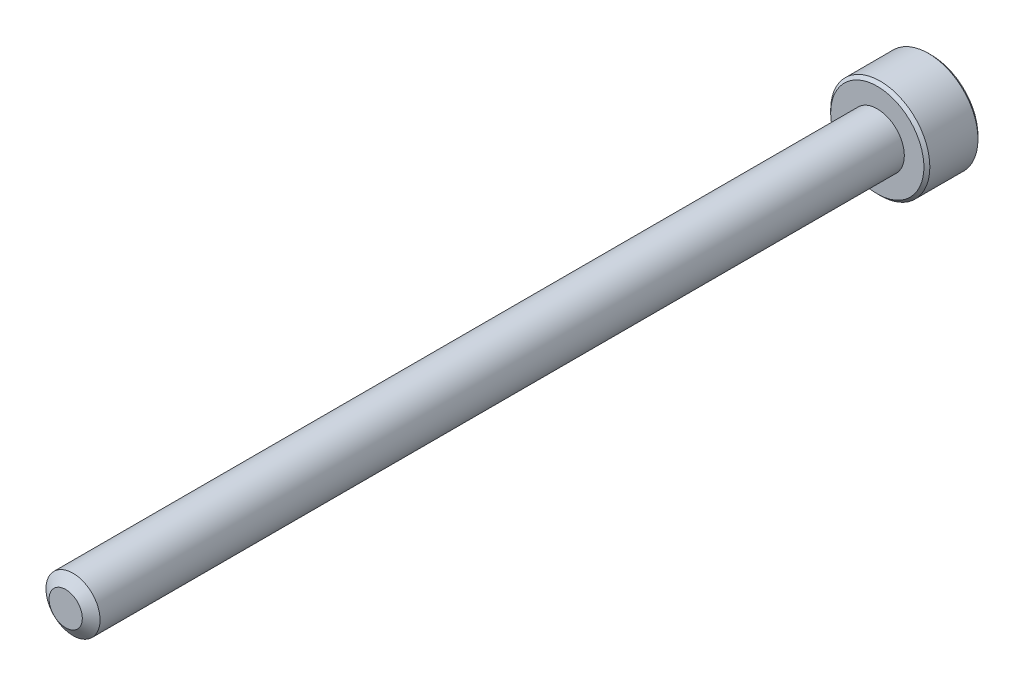
ISO-10303-21;
HEADER;
FILE_DESCRIPTION(('STEP AP214'),'2;1');
FILE_NAME('part.step','',(''),(''),'','','');
FILE_SCHEMA(('AUTOMOTIVE_DESIGN { 1 0 10303 214 1 1 1 1 }'));
ENDSEC;
DATA;
#1=APPLICATION_CONTEXT('core data for automotive mechanical design processes');
#2=APPLICATION_PROTOCOL_DEFINITION('international standard','automotive_design',2000,#1);
#3=PRODUCT_CONTEXT('',#1,'mechanical');
#4=PRODUCT('Part','Part','',(#3));
#5=PRODUCT_RELATED_PRODUCT_CATEGORY('part','',(#4));
#6=PRODUCT_DEFINITION_FORMATION('','',#4);
#7=PRODUCT_DEFINITION_CONTEXT('part definition',#1,'design');
#8=PRODUCT_DEFINITION('design','',#6,#7);
#9=PRODUCT_DEFINITION_SHAPE('','',#8);
#10=(LENGTH_UNIT() NAMED_UNIT(*) SI_UNIT(.MILLI.,.METRE.));
#11=(NAMED_UNIT(*) PLANE_ANGLE_UNIT() SI_UNIT($,.RADIAN.));
#12=(NAMED_UNIT(*) SI_UNIT($,.STERADIAN.) SOLID_ANGLE_UNIT());
#13=UNCERTAINTY_MEASURE_WITH_UNIT(LENGTH_MEASURE(1.E-05),#10,'distance_accuracy_value','');
#14=(GEOMETRIC_REPRESENTATION_CONTEXT(3) GLOBAL_UNCERTAINTY_ASSIGNED_CONTEXT((#13)) GLOBAL_UNIT_ASSIGNED_CONTEXT((#10,
#11,#12)) REPRESENTATION_CONTEXT('',''));
#15=CARTESIAN_POINT('',(0.,0.,0.));
#16=DIRECTION('',(0.,0.,1.));
#17=DIRECTION('',(1.,0.,0.));
#18=AXIS2_PLACEMENT_3D('',#15,#16,#17);
#19=CARTESIAN_POINT('',(0.,0.,-45.));
#20=DIRECTION('',(0.,0.,0.999999999999999));
#21=DIRECTION('',(1.,0.,0.));
#22=AXIS2_PLACEMENT_3D('',#19,#20,#21);
#23=CYLINDRICAL_SURFACE('',#22,1.5);
#24=CARTESIAN_POINT('',(0.,0.,-45.));
#25=DIRECTION('',(0.,0.,-0.999999999999999));
#26=DIRECTION('',(-1.,0.,0.));
#27=AXIS2_PLACEMENT_3D('',#24,#25,#26);
#28=CIRCLE('',#27,1.5);
#29=CARTESIAN_POINT('',(1.5,0.,-45.));
#30=VERTEX_POINT('',#29);
#31=EDGE_CURVE('E217',#30,#30,#28,.F.);
#32=CARTESIAN_POINT('',(0.,0.,-0.405251783209382));
#33=DIRECTION('',(0.,0.,0.999999999999999));
#34=DIRECTION('',(1.,0.,0.));
#35=AXIS2_PLACEMENT_3D('',#32,#33,#34);
#36=CIRCLE('',#35,1.5);
#37=CARTESIAN_POINT('',(1.5,0.,-0.405251783209375));
#38=VERTEX_POINT('',#37);
#39=EDGE_CURVE('E114',#38,#38,#36,.T.);
#40=CARTESIAN_POINT('',(1.5,0.,-45.));
#41=CARTESIAN_POINT('',(1.5,0.,-44.5354713727418));
#42=CARTESIAN_POINT('',(1.5,0.,-44.0709427454835));
#43=CARTESIAN_POINT('',(1.5,0.,-43.141885490967));
#44=CARTESIAN_POINT('',(1.5,0.,-42.6773568637088));
#45=CARTESIAN_POINT('',(1.5,0.,-41.7482996091923));
#46=CARTESIAN_POINT('',(1.5,0.,-41.2837709819341));
#47=CARTESIAN_POINT('',(1.5,0.,-40.3547137274176));
#48=CARTESIAN_POINT('',(1.5,0.,-39.8901851001594));
#49=CARTESIAN_POINT('',(1.5,0.,-38.9611278456429));
#50=CARTESIAN_POINT('',(1.5,0.,-38.4965992183847));
#51=CARTESIAN_POINT('',(1.5,0.,-37.5675419638682));
#52=CARTESIAN_POINT('',(1.5,0.,-37.10301333661));
#53=CARTESIAN_POINT('',(1.5,0.,-36.1739560820935));
#54=CARTESIAN_POINT('',(1.5,0.,-35.7094274548353));
#55=CARTESIAN_POINT('',(1.5,0.,-34.7803702003188));
#56=CARTESIAN_POINT('',(1.5,0.,-34.3158415730606));
#57=CARTESIAN_POINT('',(1.5,0.,-33.3867843185441));
#58=CARTESIAN_POINT('',(1.5,0.,-32.9222556912859));
#59=CARTESIAN_POINT('',(1.5,0.,-31.9931984367694));
#60=CARTESIAN_POINT('',(1.5,0.,-31.5286698095112));
#61=CARTESIAN_POINT('',(1.5,0.,-30.5996125549947));
#62=CARTESIAN_POINT('',(1.5,0.,-30.1350839277364));
#63=CARTESIAN_POINT('',(1.5,0.,-29.20602667322));
#64=CARTESIAN_POINT('',(1.5,0.,-28.7414980459617));
#65=CARTESIAN_POINT('',(1.5,0.,-27.8124407914453));
#66=CARTESIAN_POINT('',(1.5,0.,-27.347912164187));
#67=CARTESIAN_POINT('',(1.5,0.,-26.4188549096706));
#68=CARTESIAN_POINT('',(1.5,0.,-25.9543262824123));
#69=CARTESIAN_POINT('',(1.5,0.,-25.0252690278959));
#70=CARTESIAN_POINT('',(1.5,0.,-24.5607404006376));
#71=CARTESIAN_POINT('',(1.5,0.,-23.6316831461212));
#72=CARTESIAN_POINT('',(1.5,0.,-23.1671545188629));
#73=CARTESIAN_POINT('',(1.5,0.,-22.2380972643464));
#74=CARTESIAN_POINT('',(1.5,0.,-21.7735686370882));
#75=CARTESIAN_POINT('',(1.5,0.,-20.8445113825717));
#76=CARTESIAN_POINT('',(1.5,0.,-20.3799827553135));
#77=CARTESIAN_POINT('',(1.5,0.,-19.450925500797));
#78=CARTESIAN_POINT('',(1.5,0.,-18.9863968735388));
#79=CARTESIAN_POINT('',(1.5,0.,-18.0573396190223));
#80=CARTESIAN_POINT('',(1.5,0.,-17.5928109917641));
#81=CARTESIAN_POINT('',(1.5,0.,-16.6637537372476));
#82=CARTESIAN_POINT('',(1.5,0.,-16.1992251099894));
#83=CARTESIAN_POINT('',(1.5,0.,-15.2701678554729));
#84=CARTESIAN_POINT('',(1.5,0.,-14.8056392282147));
#85=CARTESIAN_POINT('',(1.5,0.,-13.8765819736982));
#86=CARTESIAN_POINT('',(1.5,0.,-13.41205334644));
#87=CARTESIAN_POINT('',(1.5,0.,-12.4829960919235));
#88=CARTESIAN_POINT('',(1.5,0.,-12.0184674646653));
#89=CARTESIAN_POINT('',(1.5,0.,-11.0894102101488));
#90=CARTESIAN_POINT('',(1.5,0.,-10.6248815828906));
#91=CARTESIAN_POINT('',(1.5,0.,-9.69582432837409));
#92=CARTESIAN_POINT('',(1.5,0.,-9.23129570111585));
#93=CARTESIAN_POINT('',(1.5,0.,-8.30223844659938));
#94=CARTESIAN_POINT('',(1.5,0.,-7.83770981934115));
#95=CARTESIAN_POINT('',(1.5,0.,-6.90865256482468));
#96=CARTESIAN_POINT('',(1.5,0.,-6.44412393756644));
#97=CARTESIAN_POINT('',(1.5,0.,-5.51506668304997));
#98=CARTESIAN_POINT('',(1.5,0.,-5.05053805579173));
#99=CARTESIAN_POINT('',(1.5,0.,-4.12148080127526));
#100=CARTESIAN_POINT('',(1.5,0.,-3.65695217401703));
#101=CARTESIAN_POINT('',(1.5,0.,-2.72789491950056));
#102=CARTESIAN_POINT('',(1.5,0.,-2.26336629224232));
#103=CARTESIAN_POINT('',(1.5,0.,-1.33430903772585));
#104=CARTESIAN_POINT('',(1.5,0.,-0.869780410467612));
#105=CARTESIAN_POINT('',(1.5,0.,-0.405251783209375));
#106=B_SPLINE_CURVE_WITH_KNOTS('',3,(#40,#41,#42,#43,#44,#45,#46,#47,#48,#49,#50,#51,#52,#53,
#54,#55,#56,#57,#58,#59,#60,#61,#62,#63,#64,#65,#66,#67,#68,#69,#70,#71,#72,#73,#74,#75,#76,#77,
#78,#79,#80,#81,#82,#83,#84,#85,#86,#87,#88,#89,#90,#91,#92,#93,#94,#95,#96,#97,#98,#99,#100,
#101,#102,#103,#104,#105),.UNSPECIFIED.,.F.,.F.,(4,2,2,2,2,2,2,2,2,2,2,2,2,2,2,2,2,2,2,2,2,2,2,
2,2,2,2,2,2,2,2,2,4),(0.,1.39358588177471,2.78717176354942,4.18075764532412,5.57434352709883,
6.96792940887354,8.36151529064824,9.75510117242295,11.1486870541977,12.5422729359724,
13.9358588177471,15.3294446995218,16.7230305812965,18.1166164630712,19.5102023448459,
20.9037882266206,22.2973741083953,23.69095999017,25.0845458719447,26.4781317537194,
27.8717176354941,29.2653035172688,30.6588893990435,32.0524752808182,33.446061162593,
34.8396470443677,36.2332329261424,37.6268188079171,39.0204046896918,40.4139905714665,
41.8075764532412,43.2011623350159,44.5947482167906),.UNSPECIFIED.);
#107=EDGE_CURVE('BSEAM40',#30,#38,#106,.T.);
#108=ORIENTED_EDGE('',*,*,#31,.T.);
#109=ORIENTED_EDGE('',*,*,#39,.F.);
#110=ORIENTED_EDGE('',*,*,#107,.T.);
#111=ORIENTED_EDGE('',*,*,#107,.F.);
#112=EDGE_LOOP('',(#108,#110,#109,#111));
#113=FACE_BOUND('',#112,.T.);
#114=ADVANCED_FACE('F40',(#113),#23,.T.);
#115=CARTESIAN_POINT('',(0.,0.,0.));
#116=DIRECTION('',(0.,0.,-0.999999999999999));
#117=DIRECTION('',(-1.,0.,0.));
#118=AXIS2_PLACEMENT_3D('',#115,#116,#117);
#119=CONICAL_SURFACE('',#118,0.921240473580834,0.959931088596884);
#120=ORIENTED_EDGE('',*,*,#39,.T.);
#121=EDGE_LOOP('',(#120));
#122=FACE_BOUND('',#121,.T.);
#123=CARTESIAN_POINT('',(0.,0.,0.));
#124=DIRECTION('',(0.,0.,0.999999999999999));
#125=DIRECTION('',(1.,0.,0.));
#126=AXIS2_PLACEMENT_3D('',#123,#124,#125);
#127=CIRCLE('',#126,0.921240473580834);
#128=CARTESIAN_POINT('',(0.921240473580835,0.,0.));
#129=VERTEX_POINT('',#128);
#130=EDGE_CURVE('E215',#129,#129,#127,.T.);
#131=ORIENTED_EDGE('',*,*,#130,.F.);
#132=EDGE_LOOP('',(#131));
#133=FACE_BOUND('',#132,.T.);
#134=ADVANCED_FACE('F198',(#122,#133),#119,.T.);
#135=CARTESIAN_POINT('',(0.,0.,0.));
#136=DIRECTION('',(0.,0.,0.999999999999999));
#137=DIRECTION('',(1.,0.,0.));
#138=AXIS2_PLACEMENT_3D('',#135,#136,#137);
#139=PLANE('',#138);
#140=ORIENTED_EDGE('',*,*,#130,.T.);
#141=EDGE_LOOP('',(#140));
#142=FACE_BOUND('',#141,.T.);
#143=ADVANCED_FACE('F195',(#142),#139,.T.);
#144=CARTESIAN_POINT('',(0.,0.,-48.));
#145=DIRECTION('',(0.,0.,0.999999999999999));
#146=DIRECTION('',(1.,0.,0.));
#147=AXIS2_PLACEMENT_3D('',#144,#145,#146);
#148=CYLINDRICAL_SURFACE('',#147,2.75);
#149=CARTESIAN_POINT('',(0.,0.,-47.835));
#150=DIRECTION('',(0.,0.,-0.999999999999999));
#151=DIRECTION('',(-1.,0.,0.));
#152=AXIS2_PLACEMENT_3D('',#149,#150,#151);
#153=CIRCLE('',#152,2.75);
#154=CARTESIAN_POINT('',(2.75,0.,-47.835));
#155=VERTEX_POINT('',#154);
#156=EDGE_CURVE('E48',#155,#155,#153,.F.);
#157=CARTESIAN_POINT('',(0.,0.,-45.165));
#158=DIRECTION('',(0.,0.,-0.999999999999999));
#159=DIRECTION('',(-1.,0.,0.));
#160=AXIS2_PLACEMENT_3D('',#157,#158,#159);
#161=CIRCLE('',#160,2.75);
#162=CARTESIAN_POINT('',(2.75,0.,-45.165));
#163=VERTEX_POINT('',#162);
#164=EDGE_CURVE('E174',#163,#163,#161,.T.);
#165=CARTESIAN_POINT('',(2.75,0.,-47.835));
#166=CARTESIAN_POINT('',(2.75,0.,-47.8071875));
#167=CARTESIAN_POINT('',(2.75,0.,-47.779375));
#168=CARTESIAN_POINT('',(2.75,0.,-47.72375));
#169=CARTESIAN_POINT('',(2.75,0.,-47.6959375));
#170=CARTESIAN_POINT('',(2.75,0.,-47.6403125));
#171=CARTESIAN_POINT('',(2.75,0.,-47.6125));
#172=CARTESIAN_POINT('',(2.75,0.,-47.556875));
#173=CARTESIAN_POINT('',(2.75,0.,-47.5290625));
#174=CARTESIAN_POINT('',(2.75,0.,-47.4734375));
#175=CARTESIAN_POINT('',(2.75,0.,-47.445625));
#176=CARTESIAN_POINT('',(2.75,0.,-47.39));
#177=CARTESIAN_POINT('',(2.75,0.,-47.3621875));
#178=CARTESIAN_POINT('',(2.75,0.,-47.3065625));
#179=CARTESIAN_POINT('',(2.75,0.,-47.27875));
#180=CARTESIAN_POINT('',(2.75,0.,-47.223125));
#181=CARTESIAN_POINT('',(2.75,0.,-47.1953125));
#182=CARTESIAN_POINT('',(2.75,0.,-47.1396875));
#183=CARTESIAN_POINT('',(2.75,0.,-47.111875));
#184=CARTESIAN_POINT('',(2.75,0.,-47.05625));
#185=CARTESIAN_POINT('',(2.75,0.,-47.0284375));
#186=CARTESIAN_POINT('',(2.75,0.,-46.9728125));
#187=CARTESIAN_POINT('',(2.75,0.,-46.945));
#188=CARTESIAN_POINT('',(2.75,0.,-46.889375));
#189=CARTESIAN_POINT('',(2.75,0.,-46.8615625));
#190=CARTESIAN_POINT('',(2.75,0.,-46.8059375));
#191=CARTESIAN_POINT('',(2.75,0.,-46.778125));
#192=CARTESIAN_POINT('',(2.75,0.,-46.7225));
#193=CARTESIAN_POINT('',(2.75,0.,-46.6946875));
#194=CARTESIAN_POINT('',(2.75,0.,-46.6390625));
#195=CARTESIAN_POINT('',(2.75,0.,-46.61125));
#196=CARTESIAN_POINT('',(2.75,0.,-46.555625));
#197=CARTESIAN_POINT('',(2.75,0.,-46.5278125));
#198=CARTESIAN_POINT('',(2.75,0.,-46.4721875));
#199=CARTESIAN_POINT('',(2.75,0.,-46.444375));
#200=CARTESIAN_POINT('',(2.75,0.,-46.38875));
#201=CARTESIAN_POINT('',(2.75,0.,-46.3609375));
#202=CARTESIAN_POINT('',(2.75,0.,-46.3053125));
#203=CARTESIAN_POINT('',(2.75,0.,-46.2775));
#204=CARTESIAN_POINT('',(2.75,0.,-46.221875));
#205=CARTESIAN_POINT('',(2.75,0.,-46.1940625));
#206=CARTESIAN_POINT('',(2.75,0.,-46.1384375));
#207=CARTESIAN_POINT('',(2.75,0.,-46.110625));
#208=CARTESIAN_POINT('',(2.75,0.,-46.055));
#209=CARTESIAN_POINT('',(2.75,0.,-46.0271875));
#210=CARTESIAN_POINT('',(2.75,0.,-45.9715625));
#211=CARTESIAN_POINT('',(2.75,0.,-45.94375));
#212=CARTESIAN_POINT('',(2.75,0.,-45.888125));
#213=CARTESIAN_POINT('',(2.75,0.,-45.8603125));
#214=CARTESIAN_POINT('',(2.75,0.,-45.8046875));
#215=CARTESIAN_POINT('',(2.75,0.,-45.776875));
#216=CARTESIAN_POINT('',(2.75,0.,-45.72125));
#217=CARTESIAN_POINT('',(2.75,0.,-45.6934375));
#218=CARTESIAN_POINT('',(2.75,0.,-45.6378125));
#219=CARTESIAN_POINT('',(2.75,0.,-45.61));
#220=CARTESIAN_POINT('',(2.75,0.,-45.554375));
#221=CARTESIAN_POINT('',(2.75,0.,-45.5265625));
#222=CARTESIAN_POINT('',(2.75,0.,-45.4709375));
#223=CARTESIAN_POINT('',(2.75,0.,-45.443125));
#224=CARTESIAN_POINT('',(2.75,0.,-45.3875));
#225=CARTESIAN_POINT('',(2.75,0.,-45.3596875));
#226=CARTESIAN_POINT('',(2.75,0.,-45.3040625));
#227=CARTESIAN_POINT('',(2.75,0.,-45.27625));
#228=CARTESIAN_POINT('',(2.75,0.,-45.220625));
#229=CARTESIAN_POINT('',(2.75,0.,-45.1928125));
#230=CARTESIAN_POINT('',(2.75,0.,-45.165));
#231=B_SPLINE_CURVE_WITH_KNOTS('',3,(#165,#166,#167,#168,#169,#170,#171,#172,#173,#174,#175,
#176,#177,#178,#179,#180,#181,#182,#183,#184,#185,#186,#187,#188,#189,#190,#191,#192,#193,#194,
#195,#196,#197,#198,#199,#200,#201,#202,#203,#204,#205,#206,#207,#208,#209,#210,#211,#212,#213,
#214,#215,#216,#217,#218,#219,#220,#221,#222,#223,#224,#225,#226,#227,#228,#229,#230),
.UNSPECIFIED.,.F.,.F.,(4,2,2,2,2,2,2,2,2,2,2,2,2,2,2,2,2,2,2,2,2,2,2,2,2,2,2,2,2,2,2,2,4),(0.,
0.0834375000000054,0.166875000000004,0.250312500000002,0.333750000000001,0.417187500000006,
0.500625000000005,0.584062500000003,0.667500000000008,0.750937500000007,0.834375000000005,
0.917812500000004,1.00125,1.08468750000001,1.16812500000001,1.2515625,1.33500000000001,
1.41843750000001,1.50187500000001,1.58531250000001,1.66875,1.75218750000001,1.83562500000001,
1.91906250000001,2.00250000000001,2.08593750000001,2.16937500000001,2.25281250000001,
2.33625000000001,2.41968750000001,2.50312500000001,2.58656250000001,2.67000000000001),.UNSPECIFIED.);
#232=EDGE_CURVE('BSEAM179',#155,#163,#231,.T.);
#233=ORIENTED_EDGE('',*,*,#156,.T.);
#234=ORIENTED_EDGE('',*,*,#164,.T.);
#235=ORIENTED_EDGE('',*,*,#232,.T.);
#236=ORIENTED_EDGE('',*,*,#232,.F.);
#237=EDGE_LOOP('',(#233,#235,#234,#236));
#238=FACE_BOUND('',#237,.T.);
#239=ADVANCED_FACE('F179',(#238),#148,.T.);
#240=CARTESIAN_POINT('',(0.,0.,-48.));
#241=DIRECTION('',(0.,0.,-0.999999999999999));
#242=DIRECTION('',(-1.,0.,0.));
#243=AXIS2_PLACEMENT_3D('',#240,#241,#242);
#244=PLANE('',#243);
#245=CARTESIAN_POINT('',(0.,0.,-48.));
#246=DIRECTION('',(0.,0.,-0.999999999999999));
#247=DIRECTION('',(-1.,0.,0.));
#248=AXIS2_PLACEMENT_3D('',#245,#246,#247);
#249=CIRCLE('',#248,2.58500000000001);
#250=CARTESIAN_POINT('',(2.58500000000002,0.,-48.));
#251=VERTEX_POINT('',#250);
#252=EDGE_CURVE('E113',#251,#251,#249,.T.);
#253=ORIENTED_EDGE('',*,*,#252,.T.);
#254=EDGE_LOOP('',(#253));
#255=FACE_BOUND('',#254,.T.);
#256=CARTESIAN_POINT('',(0.,0.,-48.));
#257=DIRECTION('',(0.,0.,-0.999999999999999));
#258=DIRECTION('',(-1.,0.,0.));
#259=AXIS2_PLACEMENT_3D('',#256,#257,#258);
#260=CIRCLE('',#259,1.44337567297406);
#261=CARTESIAN_POINT('',(-1.25,0.721687836487045,-48.));
#262=VERTEX_POINT('',#261);
#263=CARTESIAN_POINT('',(0.,1.44337567297406,-48.));
#264=VERTEX_POINT('',#263);
#265=EDGE_CURVE('E94',#262,#264,#260,.T.);
#266=ORIENTED_EDGE('',*,*,#265,.F.);
#267=CARTESIAN_POINT('',(-1.25,-0.721687836487045,-48.));
#268=VERTEX_POINT('',#267);
#269=EDGE_CURVE('E54',#268,#262,#260,.T.);
#270=ORIENTED_EDGE('',*,*,#269,.F.);
#271=CARTESIAN_POINT('',(0.,-1.44337567297406,-48.));
#272=VERTEX_POINT('',#271);
#273=EDGE_CURVE('E273',#272,#268,#260,.T.);
#274=ORIENTED_EDGE('',*,*,#273,.F.);
#275=CARTESIAN_POINT('',(1.24999999999999,-0.721687836487073,-48.));
#276=VERTEX_POINT('',#275);
#277=EDGE_CURVE('E61',#276,#272,#260,.T.);
#278=ORIENTED_EDGE('',*,*,#277,.F.);
#279=CARTESIAN_POINT('',(1.24999999999999,0.721687836487045,-48.));
#280=VERTEX_POINT('',#279);
#281=EDGE_CURVE('E135',#280,#276,#260,.T.);
#282=ORIENTED_EDGE('',*,*,#281,.F.);
#283=EDGE_CURVE('E103',#264,#280,#260,.T.);
#284=ORIENTED_EDGE('',*,*,#283,.F.);
#285=EDGE_LOOP('',(#266,#270,#274,#278,#282,#284));
#286=FACE_BOUND('',#285,.T.);
#287=ADVANCED_FACE('F134',(#255,#286),#244,.T.);
#288=CARTESIAN_POINT('',(0.,0.,-45.));
#289=DIRECTION('',(0.,0.,-0.999999999999999));
#290=DIRECTION('',(-1.,0.,0.));
#291=AXIS2_PLACEMENT_3D('',#288,#289,#290);
#292=PLANE('',#291);
#293=CARTESIAN_POINT('',(0.,0.,-45.));
#294=DIRECTION('',(0.,0.,-0.999999999999999));
#295=DIRECTION('',(-1.,0.,0.));
#296=AXIS2_PLACEMENT_3D('',#293,#294,#295);
#297=CIRCLE('',#296,2.585);
#298=CARTESIAN_POINT('',(-2.58500000000001,0.,-45.));
#299=VERTEX_POINT('',#298);
#300=EDGE_CURVE('E11',#299,#299,#297,.F.);
#301=ORIENTED_EDGE('',*,*,#300,.T.);
#302=EDGE_LOOP('',(#301));
#303=FACE_BOUND('',#302,.T.);
#304=ORIENTED_EDGE('',*,*,#31,.F.);
#305=EDGE_LOOP('',(#304));
#306=FACE_BOUND('',#305,.T.);
#307=ADVANCED_FACE('F188',(#303,#306),#292,.F.);
#308=CARTESIAN_POINT('',(0.,0.,-48.));
#309=DIRECTION('',(0.,0.,-0.999999999999999));
#310=DIRECTION('',(-1.,0.,0.));
#311=AXIS2_PLACEMENT_3D('',#308,#309,#310);
#312=CONICAL_SURFACE('',#311,1.44337567297406,0.78539816339745);
#313=ORIENTED_EDGE('',*,*,#283,.T.);
#314=CARTESIAN_POINT('',(-0.000200000000033507,1.44349114302786,-48.0001154839091));
#315=CARTESIAN_POINT('',(0.0427751670715852,1.41867941875062,-47.9753216680551));
#316=CARTESIAN_POINT('',(0.0864690047459564,1.39345276980741,-47.9519837344187));
#317=CARTESIAN_POINT('',(0.175565930841961,1.34201263554191,-47.9092520040846));
#318=CARTESIAN_POINT('',(0.220977498357083,1.31579425481273,-47.8898819923604));
#319=CARTESIAN_POINT('',(0.312547820935291,1.26292610442243,-47.8567004834135));
#320=CARTESIAN_POINT('',(0.358683240175928,1.23628980770468,-47.8428055590527));
#321=CARTESIAN_POINT('',(0.451970080407619,1.18243062538503,-47.8213972821606));
#322=CARTESIAN_POINT('',(0.49911864913638,1.15520938653753,-47.8138679415667));
#323=CARTESIAN_POINT('',(0.580373556887251,1.1082968436746,-47.8070744980507));
#324=CARTESIAN_POINT('',(0.614374876627952,1.08866617256954,-47.8060685591044));
#325=CARTESIAN_POINT('',(0.682317764432493,1.04943932800609,-47.8077614149114));
#326=CARTESIAN_POINT('',(0.716259317655666,1.02984316311597,-47.8104610272156));
#327=CARTESIAN_POINT('',(0.783814856457502,0.99083995460348,-47.8194089303164));
#328=CARTESIAN_POINT('',(0.817428507286779,0.971433104248763,-47.8256605258997));
#329=CARTESIAN_POINT('',(0.884094638217806,0.932943395609879,-47.8413756814139));
#330=CARTESIAN_POINT('',(0.917146871030277,0.913860680098245,-47.8508406200874));
#331=CARTESIAN_POINT('',(1.00179969160023,0.864986351354492,-47.8789313906875));
#332=CARTESIAN_POINT('',(1.05286649242961,0.835502920149043,-47.8996701574522));
#333=CARTESIAN_POINT('',(1.15300085411324,0.777690319475932,-47.9463871346715));
#334=CARTESIAN_POINT('',(1.20207431157826,0.749357745598455,-47.9723482959468));
#335=CARTESIAN_POINT('',(1.25019999999998,0.721572366433165,-48.0001154839091));
#336=B_SPLINE_CURVE_WITH_KNOTS('',3,(#314,#315,#316,#317,#318,#319,#320,#321,#322,#323,#324,
#325,#326,#327,#328,#329,#330,#331,#332,#333,#334,#335),.UNSPECIFIED.,.F.,.F.,(4,2,2,2,2,2,2,2,
2,2,4),(0.,0.166533409618297,0.334037607289775,0.498880396489721,0.663307919240292,
0.780963963458828,0.898645970148448,1.01643764860772,1.13427993171547,1.32148652032137,
1.50809158792569),.UNSPECIFIED.);
#337=EDGE_CURVE('E108',#264,#280,#336,.T.);
#338=ORIENTED_EDGE('',*,*,#337,.F.);
#339=EDGE_LOOP('',(#313,#338));
#340=FACE_BOUND('',#339,.T.);
#341=ADVANCED_FACE('F109',(#340),#312,.F.);
#342=ORIENTED_EDGE('',*,*,#281,.T.);
#343=CARTESIAN_POINT('',(1.25,-1.43934010808078,-48.4629820968923));
#344=CARTESIAN_POINT('',(1.24999999999999,-1.40429313005661,-48.4365249226329));
#345=CARTESIAN_POINT('',(1.24999999999999,-1.36905087135601,-48.4103271603542));
#346=CARTESIAN_POINT('',(1.24999999999999,-1.29809650706313,-48.3585575718395));
#347=CARTESIAN_POINT('',(1.24999999999999,-1.26238428576498,-48.3329859043562));
#348=CARTESIAN_POINT('',(1.24999999999999,-1.15390111792709,-48.2570059936894));
#349=CARTESIAN_POINT('',(1.24999999999999,-1.08031646726265,-48.2077402861895));
#350=CARTESIAN_POINT('',(1.24999999999999,-0.926012322755097,-48.1110258302631));
#351=CARTESIAN_POINT('',(1.24999999999998,-0.845125318656147,-48.0638412989417));
#352=CARTESIAN_POINT('',(1.24999999999999,-0.6793111740766,-47.9775307343904));
#353=CARTESIAN_POINT('',(1.25000000000001,-0.594398891026686,-47.9383775346268));
#354=CARTESIAN_POINT('',(1.25,-0.466944812460734,-47.8904772236883));
#355=CARTESIAN_POINT('',(1.24999999999999,-0.426289985812813,-47.8767294897863));
#356=CARTESIAN_POINT('',(1.24999999999998,-0.343998850091256,-47.8524979274505));
#357=CARTESIAN_POINT('',(1.24999999999999,-0.30236247361495,-47.8420143238697));
#358=CARTESIAN_POINT('',(1.24999999999999,-0.21905269628565,-47.8250301617483));
#359=CARTESIAN_POINT('',(1.24999999999999,-0.177393428474482,-47.8184613604713));
#360=CARTESIAN_POINT('',(1.24999999999998,-0.0936293693401723,-47.8094350534577));
#361=CARTESIAN_POINT('',(1.24999999999997,-0.0515246558543761,-47.8069768409972));
#362=CARTESIAN_POINT('',(1.24999999999997,0.0311890576306502,-47.8063540620133));
#363=CARTESIAN_POINT('',(1.24999999999998,0.0717969625499476,-47.8080371168462));
#364=CARTESIAN_POINT('',(1.24999999999999,0.152668636885212,-47.8152682705979));
#365=CARTESIAN_POINT('',(1.24999999999999,0.192932338835372,-47.8208171104131));
#366=CARTESIAN_POINT('',(1.24999999999999,0.273499879165304,-47.8355710364649));
#367=CARTESIAN_POINT('',(1.24999999999998,0.313792180618516,-47.8448381759641));
#368=CARTESIAN_POINT('',(1.24999999999999,0.393496413911465,-47.8665361784573));
#369=CARTESIAN_POINT('',(1.25,0.432908419115073,-47.8789667767306));
#370=CARTESIAN_POINT('',(1.25000000000001,0.556992735862308,-47.9227793529314));
#371=CARTESIAN_POINT('',(1.24999999999999,0.639898924666061,-47.9591510728759));
#372=CARTESIAN_POINT('',(1.24999999999998,0.801816555499644,-48.0400191621783));
#373=CARTESIAN_POINT('',(1.24999999999999,0.880812666324987,-48.084544720912));
#374=CARTESIAN_POINT('',(1.24999999999999,1.03178561279744,-48.1764048766666));
#375=CARTESIAN_POINT('',(1.24999999999999,1.10391618485079,-48.2234899339162));
#376=CARTESIAN_POINT('',(1.24999999999999,1.21018606043304,-48.2962785615985));
#377=CARTESIAN_POINT('',(1.24999999999999,1.24515069969372,-48.3207980853933));
#378=CARTESIAN_POINT('',(1.24999999999999,1.31460220852729,-48.3704856367656));
#379=CARTESIAN_POINT('',(1.24999999999998,1.34908920596611,-48.3956534854155));
#380=CARTESIAN_POINT('',(1.24999999999997,1.38337731682905,-48.4210901488412));
#381=B_SPLINE_CURVE_WITH_KNOTS('',3,(#343,#344,#345,#346,#347,#348,#349,#350,#351,#352,#353,
#354,#355,#356,#357,#358,#359,#360,#361,#362,#363,#364,#365,#366,#367,#368,#369,#370,#371,#372,
#373,#374,#375,#376,#377,#378,#379,#380),.UNSPECIFIED.,.F.,.F.,(4,2,2,2,2,2,2,2,2,2,2,2,2,2,2,2,
2,2,4),(0.,0.131732960381452,0.263498984161657,0.529042014455854,0.809741926134652,
1.08947609717229,1.2181163427258,1.34676544783905,1.47310084517848,1.59941451973789,
1.72115042167854,1.84290966131739,1.96679153905345,2.09066305366042,2.36146692896008,
2.63325989198488,2.89154668212276,3.01965734507708,3.14773302245623),.UNSPECIFIED.);
#382=EDGE_CURVE('E102',#280,#276,#381,.F.);
#383=ORIENTED_EDGE('',*,*,#382,.F.);
#384=EDGE_LOOP('',(#342,#383));
#385=FACE_BOUND('',#384,.T.);
#386=ADVANCED_FACE('F279',(#385),#312,.F.);
#387=ORIENTED_EDGE('',*,*,#277,.T.);
#388=CARTESIAN_POINT('',(1.25019999999998,-0.721572366433249,-48.0001154839091));
#389=CARTESIAN_POINT('',(1.20722483292839,-0.746384090710491,-47.9753216680551));
#390=CARTESIAN_POINT('',(1.16353099525403,-0.771610739653711,-47.9519837344187));
#391=CARTESIAN_POINT('',(1.07443406915804,-0.8230508739192,-47.9092520040845));
#392=CARTESIAN_POINT('',(1.02902250164292,-0.849269254648379,-47.8898819923604));
#393=CARTESIAN_POINT('',(0.937452179064721,-0.902137405038679,-47.8567004834134));
#394=CARTESIAN_POINT('',(0.891316759824095,-0.928773701756427,-47.8428055590526));
#395=CARTESIAN_POINT('',(0.798029919592391,-0.982632884076059,-47.8213972821606));
#396=CARTESIAN_POINT('',(0.750881350863607,-1.00985412292354,-47.8138679415668));
#397=CARTESIAN_POINT('',(0.669626443112733,-1.05676666578648,-47.8070744980507));
#398=CARTESIAN_POINT('',(0.635625123372042,-1.07639733689156,-47.8060685591043));
#399=CARTESIAN_POINT('',(0.567682235567504,-1.11562418145503,-47.8077614149113));
#400=CARTESIAN_POINT('',(0.533740682344326,-1.13522034634514,-47.8104610272155));
#401=CARTESIAN_POINT('',(0.466185143542489,-1.17422355485764,-47.8194089303163));
#402=CARTESIAN_POINT('',(0.432571492713217,-1.19363040521238,-47.8256605258997));
#403=CARTESIAN_POINT('',(0.365905361782171,-1.23212011385122,-47.8413756814139));
#404=CARTESIAN_POINT('',(0.332853128969678,-1.2512028293628,-47.8508406200875));
#405=CARTESIAN_POINT('',(0.248200308399703,-1.3000771581065,-47.8789313906876));
#406=CARTESIAN_POINT('',(0.197133507570344,-1.32956058931203,-47.8996701574522));
#407=CARTESIAN_POINT('',(0.0969991458867512,-1.38737318998525,-47.9463871346714));
#408=CARTESIAN_POINT('',(0.0479256884217441,-1.41570576386275,-47.9723482959467));
#409=CARTESIAN_POINT('',(-0.000200000000005751,-1.44349114302791,-48.0001154839091));
#410=B_SPLINE_CURVE_WITH_KNOTS('',3,(#388,#389,#390,#391,#392,#393,#394,#395,#396,#397,#398,
#399,#400,#401,#402,#403,#404,#405,#406,#407,#408,#409),.UNSPECIFIED.,.F.,.F.,(4,2,2,2,2,2,2,2,
2,2,4),(0.,0.166533409618312,0.334037607289763,0.498880396489698,0.663307919240272,
0.780963963458824,0.898645970148445,1.01643764860772,1.13427993171548,1.32148652032139,
1.50809158792571),.UNSPECIFIED.);
#411=EDGE_CURVE('E144',#276,#272,#410,.T.);
#412=ORIENTED_EDGE('',*,*,#411,.F.);
#413=EDGE_LOOP('',(#387,#412));
#414=FACE_BOUND('',#413,.T.);
#415=ADVANCED_FACE('F276',(#414),#312,.F.);
#416=ORIENTED_EDGE('',*,*,#273,.T.);
#417=CARTESIAN_POINT('',(0.000199999999977996,-1.44349114302789,-48.0001154839091));
#418=CARTESIAN_POINT('',(-0.0427751670716011,-1.41867941875065,-47.9753216680551));
#419=CARTESIAN_POINT('',(-0.0864690047459614,-1.39345276980743,-47.9519837344186));
#420=CARTESIAN_POINT('',(-0.175565930841953,-1.34201263554194,-47.9092520040845));
#421=CARTESIAN_POINT('',(-0.220977498357074,-1.31579425481277,-47.8898819923604));
#422=CARTESIAN_POINT('',(-0.312547820935263,-1.26292610442246,-47.8567004834134));
#423=CARTESIAN_POINT('',(-0.358683240175883,-1.23628980770471,-47.8428055590526));
#424=CARTESIAN_POINT('',(-0.451970080407596,-1.18243062538509,-47.8213972821606));
#425=CARTESIAN_POINT('',(-0.499118649136394,-1.15520938653763,-47.8138679415668));
#426=CARTESIAN_POINT('',(-0.58037355688727,-1.10829684367468,-47.8070744980507));
#427=CARTESIAN_POINT('',(-0.614374876627956,-1.08866617256958,-47.8060685591043));
#428=CARTESIAN_POINT('',(-0.682317764432492,-1.04943932800611,-47.8077614149113));
#429=CARTESIAN_POINT('',(-0.716259317655674,-1.02984316311599,-47.8104610272155));
#430=CARTESIAN_POINT('',(-0.783814856457516,-0.990839954603493,-47.8194089303163));
#431=CARTESIAN_POINT('',(-0.817428507286789,-0.971433104248755,-47.8256605258997));
#432=CARTESIAN_POINT('',(-0.884094638217838,-0.932943395609911,-47.8413756814139));
#433=CARTESIAN_POINT('',(-0.917146871030335,-0.913860680098339,-47.8508406200875));
#434=CARTESIAN_POINT('',(-1.00179969160031,-0.864986351354632,-47.8789313906876));
#435=CARTESIAN_POINT('',(-1.05286649242967,-0.835502920149097,-47.8996701574522));
#436=CARTESIAN_POINT('',(-1.15300085411327,-0.777690319475874,-47.9463871346714));
#437=CARTESIAN_POINT('',(-1.20207431157828,-0.749357745598369,-47.9723482959467));
#438=CARTESIAN_POINT('',(-1.25020000000003,-0.721572366433221,-48.0001154839091));
#439=B_SPLINE_CURVE_WITH_KNOTS('',3,(#417,#418,#419,#420,#421,#422,#423,#424,#425,#426,#427,
#428,#429,#430,#431,#432,#433,#434,#435,#436,#437,#438),.UNSPECIFIED.,.F.,.F.,(4,2,2,2,2,2,2,2,
2,2,4),(0.,0.166533409618312,0.33403760728976,0.498880396489687,0.663307919240268,
0.780963963458829,0.898645970148457,1.01643764860774,1.13427993171551,1.32148652032142,
1.50809158792575),.UNSPECIFIED.);
#440=EDGE_CURVE('E251',#272,#268,#439,.T.);
#441=ORIENTED_EDGE('',*,*,#440,.F.);
#442=EDGE_LOOP('',(#416,#441));
#443=FACE_BOUND('',#442,.T.);
#444=ADVANCED_FACE('F275',(#443),#312,.F.);
#445=ORIENTED_EDGE('',*,*,#269,.T.);
#446=CARTESIAN_POINT('',(-1.25,-1.43934010829025,-48.4629820970504));
#447=CARTESIAN_POINT('',(-1.25,-1.40429313026019,-48.4365249227849));
#448=CARTESIAN_POINT('',(-1.25,-1.3690508715537,-48.4103271605002));
#449=CARTESIAN_POINT('',(-1.25,-1.29809650724897,-48.3585575719734));
#450=CARTESIAN_POINT('',(-1.25,-1.26238428594486,-48.3329859044841));
#451=CARTESIAN_POINT('',(-1.25,-1.15390111808876,-48.257005993799));
#452=CARTESIAN_POINT('',(-1.25,-1.08031646741193,-48.207740286287));
#453=CARTESIAN_POINT('',(-1.25,-0.926012322877353,-48.1110258303356));
#454=CARTESIAN_POINT('',(-1.25,-0.845125318763699,-48.0638412990015));
#455=CARTESIAN_POINT('',(-1.25,-0.679311174153482,-47.9775307344266));
#456=CARTESIAN_POINT('',(-1.25,-0.59439889108761,-47.9383775346522));
#457=CARTESIAN_POINT('',(-1.25,-0.466944812509659,-47.8904772237055));
#458=CARTESIAN_POINT('',(-1.25,-0.426289985866763,-47.8767294898039));
#459=CARTESIAN_POINT('',(-1.25,-0.343998850155413,-47.8524979274677));
#460=CARTESIAN_POINT('',(-1.25,-0.302362473684289,-47.8420143238862));
#461=CARTESIAN_POINT('',(-1.25,-0.219052696365188,-47.8250301617622));
#462=CARTESIAN_POINT('',(-1.25,-0.177393428559033,-47.8184613604834));
#463=CARTESIAN_POINT('',(-1.25,-0.0936293694345796,-47.809435053465));
#464=CARTESIAN_POINT('',(-1.25,-0.0515246559536273,-47.8069768410015));
#465=CARTESIAN_POINT('',(-1.25,0.0311890575224633,-47.8063540620107));
#466=CARTESIAN_POINT('',(-1.25,0.0717969624376563,-47.8080371168399));
#467=CARTESIAN_POINT('',(-1.25,0.152668636765118,-47.8152682705835));
#468=CARTESIAN_POINT('',(-1.25,0.192932338711579,-47.8208171103943));
#469=CARTESIAN_POINT('',(-1.25,0.273499879034213,-47.835571036437));
#470=CARTESIAN_POINT('',(-1.25,0.313792180483836,-47.8448381759314));
#471=CARTESIAN_POINT('',(-1.25,0.393496413769952,-47.8665361784149));
#472=CARTESIAN_POINT('',(-1.25000000000001,0.432908418970315,-47.8789667766833));
#473=CARTESIAN_POINT('',(-1.25000000000002,0.556992735686032,-47.9227793528609));
#474=CARTESIAN_POINT('',(-1.25000000000001,0.639898924463099,-47.9591510727842));
#475=CARTESIAN_POINT('',(-1.25,0.801816555245342,-48.0400191620417));
#476=CARTESIAN_POINT('',(-1.25,0.880812666046046,-48.0845447207517));
#477=CARTESIAN_POINT('',(-1.25,1.0317856124742,-48.176404876461));
#478=CARTESIAN_POINT('',(-1.25,1.10391618450774,-48.2234899336893));
#479=CARTESIAN_POINT('',(-1.25,1.21018606006067,-48.2962785613395));
#480=CARTESIAN_POINT('',(-1.25,1.24515069931173,-48.3207980851238));
#481=CARTESIAN_POINT('',(-1.25,1.31460220812611,-48.3704856364749));
#482=CARTESIAN_POINT('',(-1.25000000000001,1.34908920555537,-48.3956534851142));
#483=CARTESIAN_POINT('',(-1.25000000000003,1.38337731640878,-48.4210901485293));
#484=B_SPLINE_CURVE_WITH_KNOTS('',3,(#446,#447,#448,#449,#450,#451,#452,#453,#454,#455,#456,
#457,#458,#459,#460,#461,#462,#463,#464,#465,#466,#467,#468,#469,#470,#471,#472,#473,#474,#475,
#476,#477,#478,#479,#480,#481,#482,#483),.UNSPECIFIED.,.F.,.F.,(4,2,2,2,2,2,2,2,2,2,2,2,2,2,2,2,
2,2,4),(0.,0.131732960406528,0.263498984211811,0.529042014557092,0.809741926293203,
1.08947609738761,1.21811634292661,1.34676544802536,1.4731008453509,1.5994145198964,
1.72115042182433,1.84290966145043,1.96679153917278,2.09066305376605,2.36146692896716,
2.63325989189273,2.89154668194571,3.01965734485816,3.14773302219543),.UNSPECIFIED.);
#485=EDGE_CURVE('E124',#268,#262,#484,.T.);
#486=ORIENTED_EDGE('',*,*,#485,.F.);
#487=EDGE_LOOP('',(#445,#486));
#488=FACE_BOUND('',#487,.T.);
#489=ADVANCED_FACE('F288',(#488),#312,.F.);
#490=ORIENTED_EDGE('',*,*,#265,.T.);
#491=CARTESIAN_POINT('',(-1.25020000000003,0.721572366433193,-48.0001154839091));
#492=CARTESIAN_POINT('',(-1.20722483292844,0.746384090710446,-47.9753216680551));
#493=CARTESIAN_POINT('',(-1.16353099525407,0.771610739653666,-47.9519837344187));
#494=CARTESIAN_POINT('',(-1.07443406915807,0.823050873919158,-47.9092520040846));
#495=CARTESIAN_POINT('',(-1.02902250164295,0.849269254648339,-47.8898819923604));
#496=CARTESIAN_POINT('',(-0.937452179064742,0.902137405038649,-47.8567004834135));
#497=CARTESIAN_POINT('',(-0.891316759824111,0.928773701756404,-47.8428055590527));
#498=CARTESIAN_POINT('',(-0.798029919592408,0.982632884076024,-47.8213972821607));
#499=CARTESIAN_POINT('',(-0.750881350863629,1.00985412292348,-47.8138679415667));
#500=CARTESIAN_POINT('',(-0.669626443112766,1.05676666578643,-47.8070744980507));
#501=CARTESIAN_POINT('',(-0.63562512337208,1.07639733689152,-47.8060685591044));
#502=CARTESIAN_POINT('',(-0.567682235567545,1.11562418145499,-47.8077614149114));
#503=CARTESIAN_POINT('',(-0.533740682344364,1.13522034634511,-47.8104610272156));
#504=CARTESIAN_POINT('',(-0.466185143542523,1.1742235548576,-47.8194089303164));
#505=CARTESIAN_POINT('',(-0.432571492713251,1.19363040521232,-47.8256605258998));
#506=CARTESIAN_POINT('',(-0.365905361782207,1.2321201138512,-47.8413756814139));
#507=CARTESIAN_POINT('',(-0.332853128969717,1.25120282936281,-47.8508406200874));
#508=CARTESIAN_POINT('',(-0.248200308399752,1.30007715810655,-47.8789313906875));
#509=CARTESIAN_POINT('',(-0.197133507570402,1.32956058931203,-47.8996701574522));
#510=CARTESIAN_POINT('',(-0.096999145886803,1.38737318998515,-47.9463871346716));
#511=CARTESIAN_POINT('',(-0.0479256884217815,1.41570576386262,-47.9723482959469));
#512=CARTESIAN_POINT('',(0.000200000000005751,1.44349114302783,-48.0001154839091));
#513=B_SPLINE_CURVE_WITH_KNOTS('',3,(#491,#492,#493,#494,#495,#496,#497,#498,#499,#500,#501,
#502,#503,#504,#505,#506,#507,#508,#509,#510,#511,#512),.UNSPECIFIED.,.F.,.F.,(4,2,2,2,2,2,2,2,
2,2,4),(0.,0.166533409618289,0.33403760728977,0.498880396489716,0.663307919240279,
0.780963963458821,0.89864597014845,1.01643764860773,1.13427993171549,1.32148652032138,
1.50809158792568),.UNSPECIFIED.);
#514=EDGE_CURVE('E98',#262,#264,#513,.T.);
#515=ORIENTED_EDGE('',*,*,#514,.F.);
#516=EDGE_LOOP('',(#490,#515));
#517=FACE_BOUND('',#516,.T.);
#518=ADVANCED_FACE('F96',(#517),#312,.F.);
#519=CARTESIAN_POINT('',(1.25,2.16506350946105,-46.125));
#520=DIRECTION('',(0.,0.,-0.999999999999999));
#521=DIRECTION('',(-1.,0.,0.));
#522=AXIS2_PLACEMENT_3D('',#519,#520,#521);
#523=PLANE('',#522);
#524=DIRECTION('',(0.866025403784439,0.5,0.));
#525=VECTOR('',#524,1.);
#526=CARTESIAN_POINT('',(-1.25,0.721687836487045,-46.125));
#527=LINE('',#526,#525);
#528=CARTESIAN_POINT('',(-1.25,0.721687836487045,-46.125));
#529=VERTEX_POINT('',#528);
#530=CARTESIAN_POINT('',(0.,1.44337567297406,-46.125));
#531=VERTEX_POINT('',#530);
#532=EDGE_CURVE('E123',#529,#531,#527,.T.);
#533=ORIENTED_EDGE('',*,*,#532,.T.);
#534=DIRECTION('',(0.866025403784439,-0.500000000000001,0.));
#535=VECTOR('',#534,1.);
#536=CARTESIAN_POINT('',(0.,1.44337567297406,-46.125));
#537=LINE('',#536,#535);
#538=CARTESIAN_POINT('',(1.24999999999999,0.721687836487045,-46.125));
#539=VERTEX_POINT('',#538);
#540=EDGE_CURVE('E128',#531,#539,#537,.T.);
#541=ORIENTED_EDGE('',*,*,#540,.T.);
#542=DIRECTION('',(0.,-1.,0.));
#543=VECTOR('',#542,1.);
#544=CARTESIAN_POINT('',(1.24999999999999,0.721687836487045,-46.125));
#545=LINE('',#544,#543);
#546=CARTESIAN_POINT('',(1.24999999999999,-0.721687836487073,-46.125));
#547=VERTEX_POINT('',#546);
#548=EDGE_CURVE('E239',#539,#547,#545,.T.);
#549=ORIENTED_EDGE('',*,*,#548,.T.);
#550=DIRECTION('',(-0.866025403784439,-0.5,0.));
#551=VECTOR('',#550,1.);
#552=CARTESIAN_POINT('',(1.24999999999999,-0.721687836487073,-46.125));
#553=LINE('',#552,#551);
#554=CARTESIAN_POINT('',(0.,-1.44337567297406,-46.125));
#555=VERTEX_POINT('',#554);
#556=EDGE_CURVE('E236',#547,#555,#553,.T.);
#557=ORIENTED_EDGE('',*,*,#556,.T.);
#558=DIRECTION('',(-0.866025403784439,0.5,0.));
#559=VECTOR('',#558,1.);
#560=CARTESIAN_POINT('',(0.,-1.44337567297406,-46.125));
#561=LINE('',#560,#559);
#562=CARTESIAN_POINT('',(-1.25,-0.721687836487045,-46.125));
#563=VERTEX_POINT('',#562);
#564=EDGE_CURVE('E233',#555,#563,#561,.T.);
#565=ORIENTED_EDGE('',*,*,#564,.T.);
#566=DIRECTION('',(0.,1.,0.));
#567=VECTOR('',#566,1.);
#568=CARTESIAN_POINT('',(-1.25,-0.721687836487045,-46.125));
#569=LINE('',#568,#567);
#570=EDGE_CURVE('E131',#563,#529,#569,.T.);
#571=ORIENTED_EDGE('',*,*,#570,.T.);
#572=EDGE_LOOP('',(#533,#541,#549,#557,#565,#571));
#573=FACE_BOUND('',#572,.T.);
#574=ADVANCED_FACE('F163',(#573),#523,.T.);
#575=CARTESIAN_POINT('',(0.,1.44337567297406,-46.125));
#576=DIRECTION('',(0.500000000000001,0.866025403784439,0.));
#577=DIRECTION('',(-0.866025403784439,0.500000000000001,0.));
#578=AXIS2_PLACEMENT_3D('',#575,#576,#577);
#579=PLANE('',#578);
#580=DIRECTION('',(0.,0.,-0.999999999999999));
#581=VECTOR('',#580,1.);
#582=CARTESIAN_POINT('',(0.,1.44337567297406,-46.125));
#583=LINE('',#582,#581);
#584=EDGE_CURVE('E120',#531,#264,#583,.T.);
#585=ORIENTED_EDGE('',*,*,#584,.T.);
#586=ORIENTED_EDGE('',*,*,#337,.T.);
#587=DIRECTION('',(0.,0.,-0.999999999999999));
#588=VECTOR('',#587,1.);
#589=CARTESIAN_POINT('',(1.24999999999999,0.721687836487045,-46.125));
#590=LINE('',#589,#588);
#591=EDGE_CURVE('E130',#539,#280,#590,.T.);
#592=ORIENTED_EDGE('',*,*,#591,.F.);
#593=ORIENTED_EDGE('',*,*,#540,.F.);
#594=EDGE_LOOP('',(#585,#586,#592,#593));
#595=FACE_BOUND('',#594,.T.);
#596=ADVANCED_FACE('F126',(#595),#579,.F.);
#597=CARTESIAN_POINT('',(1.24999999999999,0.721687836487045,-46.125));
#598=DIRECTION('',(1.,0.,0.));
#599=DIRECTION('',(0.,0.,-0.999999999999999));
#600=AXIS2_PLACEMENT_3D('',#597,#598,#599);
#601=PLANE('',#600);
#602=ORIENTED_EDGE('',*,*,#591,.T.);
#603=ORIENTED_EDGE('',*,*,#382,.T.);
#604=DIRECTION('',(0.,0.,-0.999999999999999));
#605=VECTOR('',#604,1.);
#606=CARTESIAN_POINT('',(1.24999999999999,-0.721687836487073,-46.125));
#607=LINE('',#606,#605);
#608=EDGE_CURVE('E222',#547,#276,#607,.T.);
#609=ORIENTED_EDGE('',*,*,#608,.F.);
#610=ORIENTED_EDGE('',*,*,#548,.F.);
#611=EDGE_LOOP('',(#602,#603,#609,#610));
#612=FACE_BOUND('',#611,.T.);
#613=ADVANCED_FACE('F152',(#612),#601,.F.);
#614=CARTESIAN_POINT('',(1.24999999999999,-0.721687836487073,-46.125));
#615=DIRECTION('',(0.5,-0.866025403784439,0.));
#616=DIRECTION('',(0.866025403784439,0.5,0.));
#617=AXIS2_PLACEMENT_3D('',#614,#615,#616);
#618=PLANE('',#617);
#619=ORIENTED_EDGE('',*,*,#608,.T.);
#620=ORIENTED_EDGE('',*,*,#411,.T.);
#621=DIRECTION('',(0.,0.,-0.999999999999999));
#622=VECTOR('',#621,1.);
#623=CARTESIAN_POINT('',(0.,-1.44337567297406,-46.125));
#624=LINE('',#623,#622);
#625=EDGE_CURVE('E225',#555,#272,#624,.T.);
#626=ORIENTED_EDGE('',*,*,#625,.F.);
#627=ORIENTED_EDGE('',*,*,#556,.F.);
#628=EDGE_LOOP('',(#619,#620,#626,#627));
#629=FACE_BOUND('',#628,.T.);
#630=ADVANCED_FACE('F156',(#629),#618,.F.);
#631=CARTESIAN_POINT('',(0.,-1.44337567297406,-46.125));
#632=DIRECTION('',(-0.5,-0.866025403784439,0.));
#633=DIRECTION('',(0.86602540378444,-0.5,0.));
#634=AXIS2_PLACEMENT_3D('',#631,#632,#633);
#635=PLANE('',#634);
#636=ORIENTED_EDGE('',*,*,#625,.T.);
#637=ORIENTED_EDGE('',*,*,#440,.T.);
#638=DIRECTION('',(0.,0.,-0.999999999999999));
#639=VECTOR('',#638,1.);
#640=CARTESIAN_POINT('',(-1.25,-0.721687836487045,-46.125));
#641=LINE('',#640,#639);
#642=EDGE_CURVE('E228',#563,#268,#641,.T.);
#643=ORIENTED_EDGE('',*,*,#642,.F.);
#644=ORIENTED_EDGE('',*,*,#564,.F.);
#645=EDGE_LOOP('',(#636,#637,#643,#644));
#646=FACE_BOUND('',#645,.T.);
#647=ADVANCED_FACE('F258',(#646),#635,.F.);
#648=CARTESIAN_POINT('',(-1.25,-0.721687836487045,-46.125));
#649=DIRECTION('',(-1.,0.,0.));
#650=DIRECTION('',(0.,-1.,0.));
#651=AXIS2_PLACEMENT_3D('',#648,#649,#650);
#652=PLANE('',#651);
#653=ORIENTED_EDGE('',*,*,#642,.T.);
#654=ORIENTED_EDGE('',*,*,#485,.T.);
#655=DIRECTION('',(0.,0.,-0.999999999999999));
#656=VECTOR('',#655,1.);
#657=CARTESIAN_POINT('',(-1.25,0.721687836487045,-46.125));
#658=LINE('',#657,#656);
#659=EDGE_CURVE('E122',#529,#262,#658,.T.);
#660=ORIENTED_EDGE('',*,*,#659,.F.);
#661=ORIENTED_EDGE('',*,*,#570,.F.);
#662=EDGE_LOOP('',(#653,#654,#660,#661));
#663=FACE_BOUND('',#662,.T.);
#664=ADVANCED_FACE('F255',(#663),#652,.F.);
#665=CARTESIAN_POINT('',(-1.25,0.721687836487045,-46.125));
#666=DIRECTION('',(-0.5,0.866025403784439,0.));
#667=DIRECTION('',(-0.866025403784439,-0.5,0.));
#668=AXIS2_PLACEMENT_3D('',#665,#666,#667);
#669=PLANE('',#668);
#670=ORIENTED_EDGE('',*,*,#659,.T.);
#671=ORIENTED_EDGE('',*,*,#514,.T.);
#672=ORIENTED_EDGE('',*,*,#584,.F.);
#673=ORIENTED_EDGE('',*,*,#532,.F.);
#674=EDGE_LOOP('',(#670,#671,#672,#673));
#675=FACE_BOUND('',#674,.T.);
#676=ADVANCED_FACE('F118',(#675),#669,.F.);
#677=CARTESIAN_POINT('',(0.,0.,-48.));
#678=DIRECTION('',(0.,0.,0.999999999999999));
#679=DIRECTION('',(1.,0.,0.));
#680=AXIS2_PLACEMENT_3D('',#677,#678,#679);
#681=CONICAL_SURFACE('',#680,2.58500000000001,0.78539816339744);
#682=CARTESIAN_POINT('',(2.75000000000001,0.,-47.835));
#683=CARTESIAN_POINT('',(2.74828125000001,0.,-47.83671875));
#684=CARTESIAN_POINT('',(2.74656250000001,0.,-47.8384375));
#685=CARTESIAN_POINT('',(2.74312500000001,0.,-47.841875));
#686=CARTESIAN_POINT('',(2.74140625000001,0.,-47.84359375));
#687=CARTESIAN_POINT('',(2.73796875000001,0.,-47.84703125));
#688=CARTESIAN_POINT('',(2.73625000000001,0.,-47.84875));
#689=CARTESIAN_POINT('',(2.73281250000001,0.,-47.8521875));
#690=CARTESIAN_POINT('',(2.73109375000001,0.,-47.85390625));
#691=CARTESIAN_POINT('',(2.72765625000001,0.,-47.85734375));
#692=CARTESIAN_POINT('',(2.72593750000001,0.,-47.8590625));
#693=CARTESIAN_POINT('',(2.72250000000001,0.,-47.8625));
#694=CARTESIAN_POINT('',(2.72078125000001,0.,-47.86421875));
#695=CARTESIAN_POINT('',(2.71734375000001,0.,-47.86765625));
#696=CARTESIAN_POINT('',(2.71562500000001,0.,-47.869375));
#697=CARTESIAN_POINT('',(2.71218750000001,0.,-47.8728125));
#698=CARTESIAN_POINT('',(2.71046875000001,0.,-47.87453125));
#699=CARTESIAN_POINT('',(2.70703125000002,0.,-47.87796875));
#700=CARTESIAN_POINT('',(2.70531250000001,0.,-47.8796875));
#701=CARTESIAN_POINT('',(2.70187500000001,0.,-47.883125));
#702=CARTESIAN_POINT('',(2.70015625000001,0.,-47.88484375));
#703=CARTESIAN_POINT('',(2.69671875000001,0.,-47.88828125));
#704=CARTESIAN_POINT('',(2.69500000000001,0.,-47.89));
#705=CARTESIAN_POINT('',(2.69156250000001,0.,-47.8934375));
#706=CARTESIAN_POINT('',(2.68984375000001,0.,-47.89515625));
#707=CARTESIAN_POINT('',(2.68640625000001,0.,-47.89859375));
#708=CARTESIAN_POINT('',(2.68468750000001,0.,-47.9003125));
#709=CARTESIAN_POINT('',(2.68125000000001,0.,-47.90375));
#710=CARTESIAN_POINT('',(2.67953125000001,0.,-47.90546875));
#711=CARTESIAN_POINT('',(2.67609375000001,0.,-47.90890625));
#712=CARTESIAN_POINT('',(2.67437500000001,0.,-47.910625));
#713=CARTESIAN_POINT('',(2.67093750000001,0.,-47.9140625));
#714=CARTESIAN_POINT('',(2.66921875000001,0.,-47.91578125));
#715=CARTESIAN_POINT('',(2.66578125000002,0.,-47.91921875));
#716=CARTESIAN_POINT('',(2.66406250000001,0.,-47.9209375));
#717=CARTESIAN_POINT('',(2.66062500000001,0.,-47.924375));
#718=CARTESIAN_POINT('',(2.65890625000001,0.,-47.92609375));
#719=CARTESIAN_POINT('',(2.65546875000001,0.,-47.92953125));
#720=CARTESIAN_POINT('',(2.65375000000002,0.,-47.93125));
#721=CARTESIAN_POINT('',(2.65031250000002,0.,-47.9346875));
#722=CARTESIAN_POINT('',(2.64859375000001,0.,-47.93640625));
#723=CARTESIAN_POINT('',(2.64515625000001,0.,-47.93984375));
#724=CARTESIAN_POINT('',(2.64343750000002,0.,-47.9415625));
#725=CARTESIAN_POINT('',(2.64000000000002,0.,-47.945));
#726=CARTESIAN_POINT('',(2.63828125000002,0.,-47.94671875));
#727=CARTESIAN_POINT('',(2.63484375000002,0.,-47.95015625));
#728=CARTESIAN_POINT('',(2.63312500000001,0.,-47.951875));
#729=CARTESIAN_POINT('',(2.62968750000001,0.,-47.9553125));
#730=CARTESIAN_POINT('',(2.62796875000002,0.,-47.95703125));
#731=CARTESIAN_POINT('',(2.62453125000002,0.,-47.96046875));
#732=CARTESIAN_POINT('',(2.62281250000002,0.,-47.9621875));
#733=CARTESIAN_POINT('',(2.61937500000002,0.,-47.965625));
#734=CARTESIAN_POINT('',(2.61765625000002,0.,-47.96734375));
#735=CARTESIAN_POINT('',(2.61421875000002,0.,-47.97078125));
#736=CARTESIAN_POINT('',(2.61250000000002,0.,-47.9725));
#737=CARTESIAN_POINT('',(2.60906250000002,0.,-47.9759375));
#738=CARTESIAN_POINT('',(2.60734375000002,0.,-47.97765625));
#739=CARTESIAN_POINT('',(2.60390625000002,0.,-47.98109375));
#740=CARTESIAN_POINT('',(2.60218750000002,0.,-47.9828125));
#741=CARTESIAN_POINT('',(2.59875000000002,0.,-47.98625));
#742=CARTESIAN_POINT('',(2.59703125000002,0.,-47.98796875));
#743=CARTESIAN_POINT('',(2.59359375000002,0.,-47.99140625));
#744=CARTESIAN_POINT('',(2.59187500000002,0.,-47.993125));
#745=CARTESIAN_POINT('',(2.58843750000002,0.,-47.9965625));
#746=CARTESIAN_POINT('',(2.58671875000002,0.,-47.99828125));
#747=CARTESIAN_POINT('',(2.58500000000002,0.,-48.));
#748=B_SPLINE_CURVE_WITH_KNOTS('',3,(#682,#683,#684,#685,#686,#687,#688,#689,#690,#691,#692,
#693,#694,#695,#696,#697,#698,#699,#700,#701,#702,#703,#704,#705,#706,#707,#708,#709,#710,#711,
#712,#713,#714,#715,#716,#717,#718,#719,#720,#721,#722,#723,#724,#725,#726,#727,#728,#729,#730,
#731,#732,#733,#734,#735,#736,#737,#738,#739,#740,#741,#742,#743,#744,#745,#746,#747),
.UNSPECIFIED.,.F.,.F.,(4,2,2,2,2,2,2,2,2,2,2,2,2,2,2,2,2,2,2,2,2,2,2,2,2,2,2,2,2,2,2,2,4),(0.,
0.00729203868098559,0.0145840773619709,0.0218761160429565,0.0291681547239421,0.0364601934049276,
0.0437522320859132,0.0510442707668988,0.058336309447889,0.0656283481288746,0.0729203868098602,
0.0802124254908458,0.0875044641718314,0.094796502852817,0.102088541533803,0.109380580214788,
0.116672618895779,0.123964657576764,0.13125669625775,0.138548734938735,0.145840773619721,
0.153132812300706,0.160424850981692,0.167716889662678,0.175008928343668,0.182300967024653,
0.189593005705639,0.196885044386625,0.20417708306761,0.211469121748596,0.218761160429581,
0.226053199110567,0.233345237791557),.UNSPECIFIED.);
#749=EDGE_CURVE('BSEAM182',#155,#251,#748,.T.);
#750=ORIENTED_EDGE('',*,*,#156,.F.);
#751=ORIENTED_EDGE('',*,*,#252,.F.);
#752=ORIENTED_EDGE('',*,*,#749,.T.);
#753=ORIENTED_EDGE('',*,*,#749,.F.);
#754=EDGE_LOOP('',(#750,#752,#751,#753));
#755=FACE_BOUND('',#754,.T.);
#756=ADVANCED_FACE('F182',(#755),#681,.T.);
#757=CARTESIAN_POINT('',(0.,0.,-45.165));
#758=DIRECTION('',(0.,0.,-0.999999999999999));
#759=DIRECTION('',(-1.,0.,0.));
#760=AXIS2_PLACEMENT_3D('',#757,#758,#759);
#761=CONICAL_SURFACE('',#760,2.75,0.78539816339744);
#762=ORIENTED_EDGE('',*,*,#300,.F.);
#763=EDGE_LOOP('',(#762));
#764=FACE_BOUND('',#763,.T.);
#765=ORIENTED_EDGE('',*,*,#164,.F.);
#766=EDGE_LOOP('',(#765));
#767=FACE_BOUND('',#766,.T.);
#768=ADVANCED_FACE('F42',(#764,#767),#761,.T.);
#769=CLOSED_SHELL('',(#114,#134,#143,#239,#287,#307,#341,#386,#415,#444,#489,#518,#574,#596,
#613,#630,#647,#664,#676,#756,#768));
#770=MANIFOLD_SOLID_BREP('B2',#769);
#771=ADVANCED_BREP_SHAPE_REPRESENTATION('',(#18,#770),#14);
#772=SHAPE_DEFINITION_REPRESENTATION(#9,#771);
ENDSEC;
END-ISO-10303-21;
